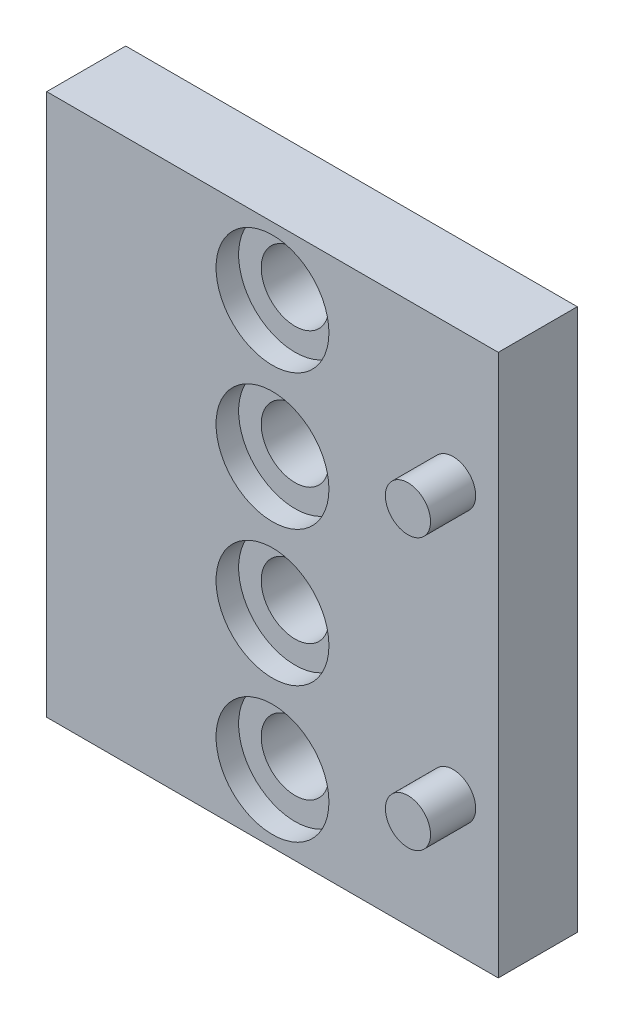
ISO-10303-21;
HEADER;
FILE_DESCRIPTION(('STEP AP214'),'2;1');
FILE_NAME('part.step','',(''),(''),'','','');
FILE_SCHEMA(('AUTOMOTIVE_DESIGN { 1 0 10303 214 1 1 1 1 }'));
ENDSEC;
DATA;
#1=APPLICATION_CONTEXT('core data for automotive mechanical design processes');
#2=APPLICATION_PROTOCOL_DEFINITION('international standard','automotive_design',2000,#1);
#3=PRODUCT_CONTEXT('',#1,'mechanical');
#4=PRODUCT('Part','Part','',(#3));
#5=PRODUCT_RELATED_PRODUCT_CATEGORY('part','',(#4));
#6=PRODUCT_DEFINITION_FORMATION('','',#4);
#7=PRODUCT_DEFINITION_CONTEXT('part definition',#1,'design');
#8=PRODUCT_DEFINITION('design','',#6,#7);
#9=PRODUCT_DEFINITION_SHAPE('','',#8);
#10=(LENGTH_UNIT() NAMED_UNIT(*) SI_UNIT(.MILLI.,.METRE.));
#11=(NAMED_UNIT(*) PLANE_ANGLE_UNIT() SI_UNIT($,.RADIAN.));
#12=(NAMED_UNIT(*) SI_UNIT($,.STERADIAN.) SOLID_ANGLE_UNIT());
#13=UNCERTAINTY_MEASURE_WITH_UNIT(LENGTH_MEASURE(1.E-05),#10,'distance_accuracy_value','');
#14=(GEOMETRIC_REPRESENTATION_CONTEXT(3) GLOBAL_UNCERTAINTY_ASSIGNED_CONTEXT((#13)) GLOBAL_UNIT_ASSIGNED_CONTEXT((#10,
#11,#12)) REPRESENTATION_CONTEXT('',''));
#15=CARTESIAN_POINT('',(0.,0.,0.));
#16=DIRECTION('',(0.,0.,1.));
#17=DIRECTION('',(1.,0.,0.));
#18=AXIS2_PLACEMENT_3D('',#15,#16,#17);
#19=CARTESIAN_POINT('',(0.,3.,0.));
#20=DIRECTION('',(0.,0.,1.));
#21=DIRECTION('',(1.,0.,0.));
#22=AXIS2_PLACEMENT_3D('',#19,#20,#21);
#23=CYLINDRICAL_SURFACE('',#22,1.5);
#24=CARTESIAN_POINT('',(0.,3.,0.4));
#25=DIRECTION('',(0.,0.,-1.));
#26=DIRECTION('',(-1.,0.,0.));
#27=AXIS2_PLACEMENT_3D('',#24,#25,#26);
#28=CIRCLE('',#27,1.5);
#29=CARTESIAN_POINT('',(-1.5,3.,0.4));
#30=VERTEX_POINT('',#29);
#31=EDGE_CURVE('E173',#30,#30,#28,.T.);
#32=ORIENTED_EDGE('',*,*,#31,.T.);
#33=EDGE_LOOP('',(#32));
#34=FACE_BOUND('',#33,.T.);
#35=CARTESIAN_POINT('',(0.,3.,2.5));
#36=DIRECTION('',(0.,0.,1.));
#37=DIRECTION('',(1.,0.,0.));
#38=AXIS2_PLACEMENT_3D('',#35,#36,#37);
#39=CIRCLE('',#38,1.5);
#40=CARTESIAN_POINT('',(1.5,3.,2.5));
#41=VERTEX_POINT('',#40);
#42=EDGE_CURVE('E39',#41,#41,#39,.F.);
#43=ORIENTED_EDGE('',*,*,#42,.F.);
#44=EDGE_LOOP('',(#43));
#45=FACE_BOUND('',#44,.T.);
#46=ADVANCED_FACE('F35',(#34,#45),#23,.F.);
#47=CARTESIAN_POINT('',(0.,-3.,0.));
#48=DIRECTION('',(0.,0.,1.));
#49=DIRECTION('',(1.,0.,0.));
#50=AXIS2_PLACEMENT_3D('',#47,#48,#49);
#51=CYLINDRICAL_SURFACE('',#50,1.5);
#52=CARTESIAN_POINT('',(0.,-3.,0.4));
#53=DIRECTION('',(0.,0.,-1.));
#54=DIRECTION('',(-1.,0.,0.));
#55=AXIS2_PLACEMENT_3D('',#52,#53,#54);
#56=CIRCLE('',#55,1.5);
#57=CARTESIAN_POINT('',(-1.5,-3.,0.4));
#58=VERTEX_POINT('',#57);
#59=EDGE_CURVE('E176',#58,#58,#56,.T.);
#60=ORIENTED_EDGE('',*,*,#59,.T.);
#61=EDGE_LOOP('',(#60));
#62=FACE_BOUND('',#61,.T.);
#63=CARTESIAN_POINT('',(0.,-3.,2.5));
#64=DIRECTION('',(0.,0.,1.));
#65=DIRECTION('',(1.,0.,0.));
#66=AXIS2_PLACEMENT_3D('',#63,#64,#65);
#67=CIRCLE('',#66,1.5);
#68=CARTESIAN_POINT('',(1.5,-3.,2.5));
#69=VERTEX_POINT('',#68);
#70=EDGE_CURVE('E190',#69,#69,#67,.F.);
#71=ORIENTED_EDGE('',*,*,#70,.F.);
#72=EDGE_LOOP('',(#71));
#73=FACE_BOUND('',#72,.T.);
#74=ADVANCED_FACE('F279',(#62,#73),#51,.F.);
#75=CARTESIAN_POINT('',(0.,-9.,0.));
#76=DIRECTION('',(0.,0.,1.));
#77=DIRECTION('',(1.,0.,0.));
#78=AXIS2_PLACEMENT_3D('',#75,#76,#77);
#79=CYLINDRICAL_SURFACE('',#78,1.5);
#80=CARTESIAN_POINT('',(0.,-9.,0.4));
#81=DIRECTION('',(0.,0.,-1.));
#82=DIRECTION('',(-1.,0.,0.));
#83=AXIS2_PLACEMENT_3D('',#80,#81,#82);
#84=CIRCLE('',#83,1.5);
#85=CARTESIAN_POINT('',(-1.5,-9.,0.4));
#86=VERTEX_POINT('',#85);
#87=EDGE_CURVE('E180',#86,#86,#84,.T.);
#88=ORIENTED_EDGE('',*,*,#87,.T.);
#89=EDGE_LOOP('',(#88));
#90=FACE_BOUND('',#89,.T.);
#91=CARTESIAN_POINT('',(0.,-9.,2.5));
#92=DIRECTION('',(0.,0.,1.));
#93=DIRECTION('',(1.,0.,0.));
#94=AXIS2_PLACEMENT_3D('',#91,#92,#93);
#95=CIRCLE('',#94,1.5);
#96=CARTESIAN_POINT('',(1.5,-9.,2.5));
#97=VERTEX_POINT('',#96);
#98=EDGE_CURVE('E188',#97,#97,#95,.F.);
#99=ORIENTED_EDGE('',*,*,#98,.F.);
#100=EDGE_LOOP('',(#99));
#101=FACE_BOUND('',#100,.T.);
#102=ADVANCED_FACE('F285',(#90,#101),#79,.F.);
#103=CARTESIAN_POINT('',(0.,9.,0.));
#104=DIRECTION('',(0.,0.,1.));
#105=DIRECTION('',(1.,0.,0.));
#106=AXIS2_PLACEMENT_3D('',#103,#104,#105);
#107=CYLINDRICAL_SURFACE('',#106,1.5);
#108=CARTESIAN_POINT('',(0.,9.,0.4));
#109=DIRECTION('',(0.,0.,-1.));
#110=DIRECTION('',(-1.,0.,0.));
#111=AXIS2_PLACEMENT_3D('',#108,#109,#110);
#112=CIRCLE('',#111,1.5);
#113=CARTESIAN_POINT('',(-1.5,9.,0.4));
#114=VERTEX_POINT('',#113);
#115=EDGE_CURVE('E144',#114,#114,#112,.T.);
#116=ORIENTED_EDGE('',*,*,#115,.T.);
#117=EDGE_LOOP('',(#116));
#118=FACE_BOUND('',#117,.T.);
#119=CARTESIAN_POINT('',(0.,9.,2.5));
#120=DIRECTION('',(0.,0.,1.));
#121=DIRECTION('',(1.,0.,0.));
#122=AXIS2_PLACEMENT_3D('',#119,#120,#121);
#123=CIRCLE('',#122,1.5);
#124=CARTESIAN_POINT('',(1.5,9.,2.5));
#125=VERTEX_POINT('',#124);
#126=EDGE_CURVE('E177',#125,#125,#123,.F.);
#127=ORIENTED_EDGE('',*,*,#126,.F.);
#128=EDGE_LOOP('',(#127));
#129=FACE_BOUND('',#128,.T.);
#130=ADVANCED_FACE('F437',(#118,#129),#107,.F.);
#131=CARTESIAN_POINT('',(-10.,12.,3.5));
#132=DIRECTION('',(1.,0.,0.));
#133=DIRECTION('',(0.,0.,-1.));
#134=AXIS2_PLACEMENT_3D('',#131,#132,#133);
#135=PLANE('',#134);
#136=DIRECTION('',(0.,-1.,0.));
#137=VECTOR('',#136,1.);
#138=CARTESIAN_POINT('',(-10.,12.,0.));
#139=LINE('',#138,#137);
#140=CARTESIAN_POINT('',(-10.,12.,0.));
#141=VERTEX_POINT('',#140);
#142=CARTESIAN_POINT('',(-10.,-12.,0.));
#143=VERTEX_POINT('',#142);
#144=EDGE_CURVE('E150',#141,#143,#139,.T.);
#145=ORIENTED_EDGE('',*,*,#144,.T.);
#146=DIRECTION('',(0.,0.,-1.));
#147=VECTOR('',#146,1.);
#148=CARTESIAN_POINT('',(-10.,-12.,3.5));
#149=LINE('',#148,#147);
#150=CARTESIAN_POINT('',(-10.,-12.,3.5));
#151=VERTEX_POINT('',#150);
#152=EDGE_CURVE('E11',#151,#143,#149,.T.);
#153=ORIENTED_EDGE('',*,*,#152,.F.);
#154=DIRECTION('',(0.,-1.,0.));
#155=VECTOR('',#154,1.);
#156=CARTESIAN_POINT('',(-10.,12.,3.5));
#157=LINE('',#156,#155);
#158=CARTESIAN_POINT('',(-10.,12.,3.5));
#159=VERTEX_POINT('',#158);
#160=EDGE_CURVE('E154',#159,#151,#157,.T.);
#161=ORIENTED_EDGE('',*,*,#160,.F.);
#162=DIRECTION('',(0.,0.,-1.));
#163=VECTOR('',#162,1.);
#164=CARTESIAN_POINT('',(-10.,12.,3.5));
#165=LINE('',#164,#163);
#166=EDGE_CURVE('E160',#159,#141,#165,.T.);
#167=ORIENTED_EDGE('',*,*,#166,.T.);
#168=EDGE_LOOP('',(#145,#153,#161,#167));
#169=FACE_BOUND('',#168,.T.);
#170=ADVANCED_FACE('F37',(#169),#135,.F.);
#171=CARTESIAN_POINT('',(-10.,-12.,3.5));
#172=DIRECTION('',(0.,1.,0.));
#173=DIRECTION('',(0.,0.,1.));
#174=AXIS2_PLACEMENT_3D('',#171,#172,#173);
#175=PLANE('',#174);
#176=DIRECTION('',(1.,0.,0.));
#177=VECTOR('',#176,1.);
#178=CARTESIAN_POINT('',(-10.,-12.,0.));
#179=LINE('',#178,#177);
#180=CARTESIAN_POINT('',(10.,-12.,0.));
#181=VERTEX_POINT('',#180);
#182=EDGE_CURVE('E163',#143,#181,#179,.T.);
#183=ORIENTED_EDGE('',*,*,#182,.T.);
#184=DIRECTION('',(0.,0.,-1.));
#185=VECTOR('',#184,1.);
#186=CARTESIAN_POINT('',(10.,-12.,3.5));
#187=LINE('',#186,#185);
#188=CARTESIAN_POINT('',(10.,-12.,3.5));
#189=VERTEX_POINT('',#188);
#190=EDGE_CURVE('E44',#189,#181,#187,.T.);
#191=ORIENTED_EDGE('',*,*,#190,.F.);
#192=DIRECTION('',(1.,0.,0.));
#193=VECTOR('',#192,1.);
#194=CARTESIAN_POINT('',(-10.,-12.,3.5));
#195=LINE('',#194,#193);
#196=EDGE_CURVE('E89',#151,#189,#195,.T.);
#197=ORIENTED_EDGE('',*,*,#196,.F.);
#198=ORIENTED_EDGE('',*,*,#152,.T.);
#199=EDGE_LOOP('',(#183,#191,#197,#198));
#200=FACE_BOUND('',#199,.T.);
#201=ADVANCED_FACE('F262',(#200),#175,.F.);
#202=CARTESIAN_POINT('',(10.,12.,3.5));
#203=DIRECTION('',(-1.,0.,0.));
#204=DIRECTION('',(0.,-1.,0.));
#205=AXIS2_PLACEMENT_3D('',#202,#203,#204);
#206=PLANE('',#205);
#207=DIRECTION('',(0.,1.,0.));
#208=VECTOR('',#207,1.);
#209=CARTESIAN_POINT('',(10.,12.,0.));
#210=LINE('',#209,#208);
#211=CARTESIAN_POINT('',(10.,12.,0.));
#212=VERTEX_POINT('',#211);
#213=EDGE_CURVE('E165',#181,#212,#210,.T.);
#214=ORIENTED_EDGE('',*,*,#213,.T.);
#215=DIRECTION('',(0.,0.,-1.));
#216=VECTOR('',#215,1.);
#217=CARTESIAN_POINT('',(10.,12.,3.5));
#218=LINE('',#217,#216);
#219=CARTESIAN_POINT('',(10.,12.,3.5));
#220=VERTEX_POINT('',#219);
#221=EDGE_CURVE('E169',#220,#212,#218,.T.);
#222=ORIENTED_EDGE('',*,*,#221,.F.);
#223=DIRECTION('',(0.,1.,0.));
#224=VECTOR('',#223,1.);
#225=CARTESIAN_POINT('',(10.,12.,3.5));
#226=LINE('',#225,#224);
#227=EDGE_CURVE('E157',#189,#220,#226,.T.);
#228=ORIENTED_EDGE('',*,*,#227,.F.);
#229=ORIENTED_EDGE('',*,*,#190,.T.);
#230=EDGE_LOOP('',(#214,#222,#228,#229));
#231=FACE_BOUND('',#230,.T.);
#232=ADVANCED_FACE('F267',(#231),#206,.F.);
#233=CARTESIAN_POINT('',(-10.,12.,3.5));
#234=DIRECTION('',(0.,-1.,0.));
#235=DIRECTION('',(0.,0.,-1.));
#236=AXIS2_PLACEMENT_3D('',#233,#234,#235);
#237=PLANE('',#236);
#238=DIRECTION('',(-1.,0.,0.));
#239=VECTOR('',#238,1.);
#240=CARTESIAN_POINT('',(-10.,12.,0.));
#241=LINE('',#240,#239);
#242=EDGE_CURVE('E82',#212,#141,#241,.T.);
#243=ORIENTED_EDGE('',*,*,#242,.T.);
#244=ORIENTED_EDGE('',*,*,#166,.F.);
#245=DIRECTION('',(-1.,0.,0.));
#246=VECTOR('',#245,1.);
#247=CARTESIAN_POINT('',(-10.,12.,3.5));
#248=LINE('',#247,#246);
#249=EDGE_CURVE('E61',#220,#159,#248,.T.);
#250=ORIENTED_EDGE('',*,*,#249,.F.);
#251=ORIENTED_EDGE('',*,*,#221,.T.);
#252=EDGE_LOOP('',(#243,#244,#250,#251));
#253=FACE_BOUND('',#252,.T.);
#254=ADVANCED_FACE('F248',(#253),#237,.F.);
#255=CARTESIAN_POINT('',(0.,0.,3.5));
#256=DIRECTION('',(0.,0.,1.));
#257=DIRECTION('',(1.,0.,0.));
#258=AXIS2_PLACEMENT_3D('',#255,#256,#257);
#259=PLANE('',#258);
#260=CARTESIAN_POINT('',(8.,-6.,3.5));
#261=DIRECTION('',(0.,0.,1.));
#262=DIRECTION('',(-1.,0.,0.));
#263=AXIS2_PLACEMENT_3D('',#260,#261,#262);
#264=CIRCLE('',#263,1.);
#265=CARTESIAN_POINT('',(7.,-6.,3.5));
#266=VERTEX_POINT('',#265);
#267=EDGE_CURVE('E229',#266,#266,#264,.T.);
#268=ORIENTED_EDGE('',*,*,#267,.F.);
#269=EDGE_LOOP('',(#268));
#270=FACE_BOUND('',#269,.T.);
#271=CARTESIAN_POINT('',(8.,6.,3.5));
#272=DIRECTION('',(0.,0.,1.));
#273=DIRECTION('',(1.,0.,0.));
#274=AXIS2_PLACEMENT_3D('',#271,#272,#273);
#275=CIRCLE('',#274,1.);
#276=CARTESIAN_POINT('',(9.,6.,3.5));
#277=VERTEX_POINT('',#276);
#278=EDGE_CURVE('E223',#277,#277,#275,.T.);
#279=ORIENTED_EDGE('',*,*,#278,.F.);
#280=EDGE_LOOP('',(#279));
#281=FACE_BOUND('',#280,.T.);
#282=CARTESIAN_POINT('',(0.,3.,3.5));
#283=DIRECTION('',(0.,0.,1.));
#284=DIRECTION('',(1.,0.,0.));
#285=AXIS2_PLACEMENT_3D('',#282,#283,#284);
#286=CIRCLE('',#285,2.5);
#287=CARTESIAN_POINT('',(2.5,3.,3.5));
#288=VERTEX_POINT('',#287);
#289=EDGE_CURVE('E218',#288,#288,#286,.T.);
#290=ORIENTED_EDGE('',*,*,#289,.F.);
#291=EDGE_LOOP('',(#290));
#292=FACE_BOUND('',#291,.T.);
#293=CARTESIAN_POINT('',(0.,-3.,3.5));
#294=DIRECTION('',(0.,0.,1.));
#295=DIRECTION('',(1.,0.,0.));
#296=AXIS2_PLACEMENT_3D('',#293,#294,#295);
#297=CIRCLE('',#296,2.5);
#298=CARTESIAN_POINT('',(2.5,-3.,3.5));
#299=VERTEX_POINT('',#298);
#300=EDGE_CURVE('E212',#299,#299,#297,.T.);
#301=ORIENTED_EDGE('',*,*,#300,.F.);
#302=EDGE_LOOP('',(#301));
#303=FACE_BOUND('',#302,.T.);
#304=CARTESIAN_POINT('',(0.,-9.,3.5));
#305=DIRECTION('',(0.,0.,1.));
#306=DIRECTION('',(1.,0.,0.));
#307=AXIS2_PLACEMENT_3D('',#304,#305,#306);
#308=CIRCLE('',#307,2.5);
#309=CARTESIAN_POINT('',(2.5,-9.,3.5));
#310=VERTEX_POINT('',#309);
#311=EDGE_CURVE('E205',#310,#310,#308,.T.);
#312=ORIENTED_EDGE('',*,*,#311,.F.);
#313=EDGE_LOOP('',(#312));
#314=FACE_BOUND('',#313,.T.);
#315=CARTESIAN_POINT('',(0.,9.,3.5));
#316=DIRECTION('',(0.,0.,1.));
#317=DIRECTION('',(1.,0.,0.));
#318=AXIS2_PLACEMENT_3D('',#315,#316,#317);
#319=CIRCLE('',#318,2.5);
#320=CARTESIAN_POINT('',(2.5,9.,3.5));
#321=VERTEX_POINT('',#320);
#322=EDGE_CURVE('E137',#321,#321,#319,.T.);
#323=ORIENTED_EDGE('',*,*,#322,.F.);
#324=EDGE_LOOP('',(#323));
#325=FACE_BOUND('',#324,.T.);
#326=ORIENTED_EDGE('',*,*,#160,.T.);
#327=ORIENTED_EDGE('',*,*,#196,.T.);
#328=ORIENTED_EDGE('',*,*,#227,.T.);
#329=ORIENTED_EDGE('',*,*,#249,.T.);
#330=EDGE_LOOP('',(#326,#327,#328,#329));
#331=FACE_BOUND('',#330,.T.);
#332=ADVANCED_FACE('F244',(#270,#281,#292,#303,#314,#325,#331),#259,.T.);
#333=CARTESIAN_POINT('',(0.,0.,0.));
#334=DIRECTION('',(0.,0.,1.));
#335=DIRECTION('',(1.,0.,0.));
#336=AXIS2_PLACEMENT_3D('',#333,#334,#335);
#337=PLANE('',#336);
#338=DIRECTION('',(-1.,0.,0.));
#339=VECTOR('',#338,1.);
#340=CARTESIAN_POINT('',(8.,-11.,0.));
#341=LINE('',#340,#339);
#342=CARTESIAN_POINT('',(8.,-11.,0.));
#343=VERTEX_POINT('',#342);
#344=CARTESIAN_POINT('',(-8.,-11.,0.));
#345=VERTEX_POINT('',#344);
#346=EDGE_CURVE('E143',#343,#345,#341,.T.);
#347=ORIENTED_EDGE('',*,*,#346,.F.);
#348=DIRECTION('',(0.,-1.,0.));
#349=VECTOR('',#348,1.);
#350=CARTESIAN_POINT('',(8.,11.,0.));
#351=LINE('',#350,#349);
#352=CARTESIAN_POINT('',(8.,11.,0.));
#353=VERTEX_POINT('',#352);
#354=EDGE_CURVE('E52',#353,#343,#351,.T.);
#355=ORIENTED_EDGE('',*,*,#354,.F.);
#356=DIRECTION('',(1.,0.,0.));
#357=VECTOR('',#356,1.);
#358=CARTESIAN_POINT('',(8.,11.,0.));
#359=LINE('',#358,#357);
#360=CARTESIAN_POINT('',(-8.,11.,0.));
#361=VERTEX_POINT('',#360);
#362=EDGE_CURVE('E131',#361,#353,#359,.T.);
#363=ORIENTED_EDGE('',*,*,#362,.F.);
#364=DIRECTION('',(0.,1.,0.));
#365=VECTOR('',#364,1.);
#366=CARTESIAN_POINT('',(-8.,11.,0.));
#367=LINE('',#366,#365);
#368=EDGE_CURVE('E134',#345,#361,#367,.T.);
#369=ORIENTED_EDGE('',*,*,#368,.F.);
#370=EDGE_LOOP('',(#347,#355,#363,#369));
#371=FACE_BOUND('',#370,.T.);
#372=ORIENTED_EDGE('',*,*,#144,.F.);
#373=ORIENTED_EDGE('',*,*,#242,.F.);
#374=ORIENTED_EDGE('',*,*,#213,.F.);
#375=ORIENTED_EDGE('',*,*,#182,.F.);
#376=EDGE_LOOP('',(#372,#373,#374,#375));
#377=FACE_BOUND('',#376,.T.);
#378=ADVANCED_FACE('F247',(#371,#377),#337,.F.);
#379=CARTESIAN_POINT('',(8.,11.,0.4));
#380=DIRECTION('',(1.,0.,0.));
#381=DIRECTION('',(0.,0.,-1.));
#382=AXIS2_PLACEMENT_3D('',#379,#380,#381);
#383=PLANE('',#382);
#384=ORIENTED_EDGE('',*,*,#354,.T.);
#385=DIRECTION('',(0.,0.,-1.));
#386=VECTOR('',#385,1.);
#387=CARTESIAN_POINT('',(8.,-11.,0.4));
#388=LINE('',#387,#386);
#389=CARTESIAN_POINT('',(8.,-11.,0.4));
#390=VERTEX_POINT('',#389);
#391=EDGE_CURVE('E109',#390,#343,#388,.T.);
#392=ORIENTED_EDGE('',*,*,#391,.F.);
#393=DIRECTION('',(0.,-1.,0.));
#394=VECTOR('',#393,1.);
#395=CARTESIAN_POINT('',(8.,11.,0.4));
#396=LINE('',#395,#394);
#397=CARTESIAN_POINT('',(8.,11.,0.4));
#398=VERTEX_POINT('',#397);
#399=EDGE_CURVE('E113',#398,#390,#396,.T.);
#400=ORIENTED_EDGE('',*,*,#399,.F.);
#401=DIRECTION('',(0.,0.,-1.));
#402=VECTOR('',#401,1.);
#403=CARTESIAN_POINT('',(8.,11.,0.4));
#404=LINE('',#403,#402);
#405=EDGE_CURVE('E148',#398,#353,#404,.T.);
#406=ORIENTED_EDGE('',*,*,#405,.T.);
#407=EDGE_LOOP('',(#384,#392,#400,#406));
#408=FACE_BOUND('',#407,.T.);
#409=ADVANCED_FACE('F111',(#408),#383,.F.);
#410=CARTESIAN_POINT('',(8.,11.,0.4));
#411=DIRECTION('',(0.,1.,0.));
#412=DIRECTION('',(0.,0.,1.));
#413=AXIS2_PLACEMENT_3D('',#410,#411,#412);
#414=PLANE('',#413);
#415=ORIENTED_EDGE('',*,*,#362,.T.);
#416=ORIENTED_EDGE('',*,*,#405,.F.);
#417=DIRECTION('',(1.,0.,0.));
#418=VECTOR('',#417,1.);
#419=CARTESIAN_POINT('',(8.,11.,0.4));
#420=LINE('',#419,#418);
#421=CARTESIAN_POINT('',(-8.,11.,0.4));
#422=VERTEX_POINT('',#421);
#423=EDGE_CURVE('E119',#422,#398,#420,.T.);
#424=ORIENTED_EDGE('',*,*,#423,.F.);
#425=DIRECTION('',(0.,0.,-1.));
#426=VECTOR('',#425,1.);
#427=CARTESIAN_POINT('',(-8.,11.,0.4));
#428=LINE('',#427,#426);
#429=EDGE_CURVE('E151',#422,#361,#428,.T.);
#430=ORIENTED_EDGE('',*,*,#429,.T.);
#431=EDGE_LOOP('',(#415,#416,#424,#430));
#432=FACE_BOUND('',#431,.T.);
#433=ADVANCED_FACE('F275',(#432),#414,.F.);
#434=CARTESIAN_POINT('',(-8.,11.,0.4));
#435=DIRECTION('',(-1.,0.,0.));
#436=DIRECTION('',(0.,-1.,0.));
#437=AXIS2_PLACEMENT_3D('',#434,#435,#436);
#438=PLANE('',#437);
#439=ORIENTED_EDGE('',*,*,#368,.T.);
#440=ORIENTED_EDGE('',*,*,#429,.F.);
#441=DIRECTION('',(0.,1.,0.));
#442=VECTOR('',#441,1.);
#443=CARTESIAN_POINT('',(-8.,11.,0.4));
#444=LINE('',#443,#442);
#445=CARTESIAN_POINT('',(-8.,-11.,0.4));
#446=VERTEX_POINT('',#445);
#447=EDGE_CURVE('E127',#446,#422,#444,.T.);
#448=ORIENTED_EDGE('',*,*,#447,.F.);
#449=DIRECTION('',(0.,0.,-1.));
#450=VECTOR('',#449,1.);
#451=CARTESIAN_POINT('',(-8.,-11.,0.4));
#452=LINE('',#451,#450);
#453=EDGE_CURVE('E118',#446,#345,#452,.T.);
#454=ORIENTED_EDGE('',*,*,#453,.T.);
#455=EDGE_LOOP('',(#439,#440,#448,#454));
#456=FACE_BOUND('',#455,.T.);
#457=ADVANCED_FACE('F298',(#456),#438,.F.);
#458=CARTESIAN_POINT('',(8.,-11.,0.4));
#459=DIRECTION('',(0.,-1.,0.));
#460=DIRECTION('',(0.,0.,-1.));
#461=AXIS2_PLACEMENT_3D('',#458,#459,#460);
#462=PLANE('',#461);
#463=ORIENTED_EDGE('',*,*,#346,.T.);
#464=ORIENTED_EDGE('',*,*,#453,.F.);
#465=DIRECTION('',(-1.,0.,0.));
#466=VECTOR('',#465,1.);
#467=CARTESIAN_POINT('',(8.,-11.,0.4));
#468=LINE('',#467,#466);
#469=EDGE_CURVE('E122',#390,#446,#468,.T.);
#470=ORIENTED_EDGE('',*,*,#469,.F.);
#471=ORIENTED_EDGE('',*,*,#391,.T.);
#472=EDGE_LOOP('',(#463,#464,#470,#471));
#473=FACE_BOUND('',#472,.T.);
#474=ADVANCED_FACE('F123',(#473),#462,.F.);
#475=CARTESIAN_POINT('',(0.,0.,0.4));
#476=DIRECTION('',(0.,0.,-1.));
#477=DIRECTION('',(-1.,0.,0.));
#478=AXIS2_PLACEMENT_3D('',#475,#476,#477);
#479=PLANE('',#478);
#480=ORIENTED_EDGE('',*,*,#115,.F.);
#481=EDGE_LOOP('',(#480));
#482=FACE_BOUND('',#481,.T.);
#483=ORIENTED_EDGE('',*,*,#87,.F.);
#484=EDGE_LOOP('',(#483));
#485=FACE_BOUND('',#484,.T.);
#486=ORIENTED_EDGE('',*,*,#59,.F.);
#487=EDGE_LOOP('',(#486));
#488=FACE_BOUND('',#487,.T.);
#489=ORIENTED_EDGE('',*,*,#31,.F.);
#490=EDGE_LOOP('',(#489));
#491=FACE_BOUND('',#490,.T.);
#492=ORIENTED_EDGE('',*,*,#399,.T.);
#493=ORIENTED_EDGE('',*,*,#469,.T.);
#494=ORIENTED_EDGE('',*,*,#447,.T.);
#495=ORIENTED_EDGE('',*,*,#423,.T.);
#496=EDGE_LOOP('',(#492,#493,#494,#495));
#497=FACE_BOUND('',#496,.T.);
#498=ADVANCED_FACE('F129',(#482,#485,#488,#491,#497),#479,.T.);
#499=CARTESIAN_POINT('',(0.,9.,2.5));
#500=DIRECTION('',(0.,0.,1.));
#501=DIRECTION('',(1.,0.,0.));
#502=AXIS2_PLACEMENT_3D('',#499,#500,#501);
#503=PLANE('',#502);
#504=CARTESIAN_POINT('',(0.,9.,2.5));
#505=DIRECTION('',(0.,0.,1.));
#506=DIRECTION('',(1.,0.,0.));
#507=AXIS2_PLACEMENT_3D('',#504,#505,#506);
#508=CIRCLE('',#507,2.5);
#509=CARTESIAN_POINT('',(2.5,9.,2.5));
#510=VERTEX_POINT('',#509);
#511=EDGE_CURVE('E187',#510,#510,#508,.T.);
#512=ORIENTED_EDGE('',*,*,#511,.T.);
#513=EDGE_LOOP('',(#512));
#514=FACE_BOUND('',#513,.T.);
#515=ORIENTED_EDGE('',*,*,#126,.T.);
#516=EDGE_LOOP('',(#515));
#517=FACE_BOUND('',#516,.T.);
#518=ADVANCED_FACE('F294',(#514,#517),#503,.T.);
#519=CARTESIAN_POINT('',(0.,9.,2.5));
#520=DIRECTION('',(0.,0.,1.));
#521=DIRECTION('',(1.,0.,0.));
#522=AXIS2_PLACEMENT_3D('',#519,#520,#521);
#523=CYLINDRICAL_SURFACE('',#522,2.5);
#524=ORIENTED_EDGE('',*,*,#511,.F.);
#525=EDGE_LOOP('',(#524));
#526=FACE_BOUND('',#525,.T.);
#527=ORIENTED_EDGE('',*,*,#322,.T.);
#528=EDGE_LOOP('',(#527));
#529=FACE_BOUND('',#528,.T.);
#530=ADVANCED_FACE('F319',(#526,#529),#523,.F.);
#531=CARTESIAN_POINT('',(0.,-9.,2.5));
#532=DIRECTION('',(0.,0.,1.));
#533=DIRECTION('',(1.,0.,0.));
#534=AXIS2_PLACEMENT_3D('',#531,#532,#533);
#535=PLANE('',#534);
#536=CARTESIAN_POINT('',(0.,-9.,2.5));
#537=DIRECTION('',(0.,0.,1.));
#538=DIRECTION('',(1.,0.,0.));
#539=AXIS2_PLACEMENT_3D('',#536,#537,#538);
#540=CIRCLE('',#539,2.5);
#541=CARTESIAN_POINT('',(2.5,-9.,2.5));
#542=VERTEX_POINT('',#541);
#543=EDGE_CURVE('E208',#542,#542,#540,.T.);
#544=ORIENTED_EDGE('',*,*,#543,.T.);
#545=EDGE_LOOP('',(#544));
#546=FACE_BOUND('',#545,.T.);
#547=ORIENTED_EDGE('',*,*,#98,.T.);
#548=EDGE_LOOP('',(#547));
#549=FACE_BOUND('',#548,.T.);
#550=ADVANCED_FACE('F326',(#546,#549),#535,.T.);
#551=CARTESIAN_POINT('',(0.,-9.,2.5));
#552=DIRECTION('',(0.,0.,1.));
#553=DIRECTION('',(1.,0.,0.));
#554=AXIS2_PLACEMENT_3D('',#551,#552,#553);
#555=CYLINDRICAL_SURFACE('',#554,2.5);
#556=ORIENTED_EDGE('',*,*,#543,.F.);
#557=EDGE_LOOP('',(#556));
#558=FACE_BOUND('',#557,.T.);
#559=ORIENTED_EDGE('',*,*,#311,.T.);
#560=EDGE_LOOP('',(#559));
#561=FACE_BOUND('',#560,.T.);
#562=ADVANCED_FACE('F334',(#558,#561),#555,.F.);
#563=CARTESIAN_POINT('',(0.,-3.,2.5));
#564=DIRECTION('',(0.,0.,1.));
#565=DIRECTION('',(1.,0.,0.));
#566=AXIS2_PLACEMENT_3D('',#563,#564,#565);
#567=PLANE('',#566);
#568=CARTESIAN_POINT('',(0.,-3.,2.5));
#569=DIRECTION('',(0.,0.,1.));
#570=DIRECTION('',(1.,0.,0.));
#571=AXIS2_PLACEMENT_3D('',#568,#569,#570);
#572=CIRCLE('',#571,2.5);
#573=CARTESIAN_POINT('',(2.5,-3.,2.5));
#574=VERTEX_POINT('',#573);
#575=EDGE_CURVE('E215',#574,#574,#572,.T.);
#576=ORIENTED_EDGE('',*,*,#575,.T.);
#577=EDGE_LOOP('',(#576));
#578=FACE_BOUND('',#577,.T.);
#579=ORIENTED_EDGE('',*,*,#70,.T.);
#580=EDGE_LOOP('',(#579));
#581=FACE_BOUND('',#580,.T.);
#582=ADVANCED_FACE('F343',(#578,#581),#567,.T.);
#583=CARTESIAN_POINT('',(0.,-3.,2.5));
#584=DIRECTION('',(0.,0.,1.));
#585=DIRECTION('',(1.,0.,0.));
#586=AXIS2_PLACEMENT_3D('',#583,#584,#585);
#587=CYLINDRICAL_SURFACE('',#586,2.5);
#588=ORIENTED_EDGE('',*,*,#575,.F.);
#589=EDGE_LOOP('',(#588));
#590=FACE_BOUND('',#589,.T.);
#591=ORIENTED_EDGE('',*,*,#300,.T.);
#592=EDGE_LOOP('',(#591));
#593=FACE_BOUND('',#592,.T.);
#594=ADVANCED_FACE('F351',(#590,#593),#587,.F.);
#595=CARTESIAN_POINT('',(0.,3.,2.5));
#596=DIRECTION('',(0.,0.,1.));
#597=DIRECTION('',(1.,0.,0.));
#598=AXIS2_PLACEMENT_3D('',#595,#596,#597);
#599=PLANE('',#598);
#600=CARTESIAN_POINT('',(0.,3.,2.5));
#601=DIRECTION('',(0.,0.,1.));
#602=DIRECTION('',(1.,0.,0.));
#603=AXIS2_PLACEMENT_3D('',#600,#601,#602);
#604=CIRCLE('',#603,2.5);
#605=CARTESIAN_POINT('',(2.5,3.,2.5));
#606=VERTEX_POINT('',#605);
#607=EDGE_CURVE('E191',#606,#606,#604,.T.);
#608=ORIENTED_EDGE('',*,*,#607,.T.);
#609=EDGE_LOOP('',(#608));
#610=FACE_BOUND('',#609,.T.);
#611=ORIENTED_EDGE('',*,*,#42,.T.);
#612=EDGE_LOOP('',(#611));
#613=FACE_BOUND('',#612,.T.);
#614=ADVANCED_FACE('F359',(#610,#613),#599,.T.);
#615=CARTESIAN_POINT('',(0.,3.,2.5));
#616=DIRECTION('',(0.,0.,1.));
#617=DIRECTION('',(1.,0.,0.));
#618=AXIS2_PLACEMENT_3D('',#615,#616,#617);
#619=CYLINDRICAL_SURFACE('',#618,2.5);
#620=ORIENTED_EDGE('',*,*,#607,.F.);
#621=EDGE_LOOP('',(#620));
#622=FACE_BOUND('',#621,.T.);
#623=ORIENTED_EDGE('',*,*,#289,.T.);
#624=EDGE_LOOP('',(#623));
#625=FACE_BOUND('',#624,.T.);
#626=ADVANCED_FACE('F367',(#622,#625),#619,.F.);
#627=CARTESIAN_POINT('',(8.,6.,5.5));
#628=DIRECTION('',(0.,0.,-1.));
#629=DIRECTION('',(-1.,0.,0.));
#630=AXIS2_PLACEMENT_3D('',#627,#628,#629);
#631=CYLINDRICAL_SURFACE('',#630,1.);
#632=CARTESIAN_POINT('',(8.,6.,5.5));
#633=DIRECTION('',(0.,0.,1.));
#634=DIRECTION('',(1.,0.,0.));
#635=AXIS2_PLACEMENT_3D('',#632,#633,#634);
#636=CIRCLE('',#635,1.);
#637=CARTESIAN_POINT('',(9.,6.,5.5));
#638=VERTEX_POINT('',#637);
#639=EDGE_CURVE('E209',#638,#638,#636,.T.);
#640=ORIENTED_EDGE('',*,*,#639,.F.);
#641=EDGE_LOOP('',(#640));
#642=FACE_BOUND('',#641,.T.);
#643=ORIENTED_EDGE('',*,*,#278,.T.);
#644=EDGE_LOOP('',(#643));
#645=FACE_BOUND('',#644,.T.);
#646=ADVANCED_FACE('F375',(#642,#645),#631,.T.);
#647=CARTESIAN_POINT('',(8.,6.,5.5));
#648=DIRECTION('',(0.,0.,1.));
#649=DIRECTION('',(1.,0.,0.));
#650=AXIS2_PLACEMENT_3D('',#647,#648,#649);
#651=PLANE('',#650);
#652=ORIENTED_EDGE('',*,*,#639,.T.);
#653=EDGE_LOOP('',(#652));
#654=FACE_BOUND('',#653,.T.);
#655=ADVANCED_FACE('F240',(#654),#651,.T.);
#656=CARTESIAN_POINT('',(8.,-6.,5.5));
#657=DIRECTION('',(0.,0.,-1.));
#658=DIRECTION('',(-1.,0.,0.));
#659=AXIS2_PLACEMENT_3D('',#656,#657,#658);
#660=CYLINDRICAL_SURFACE('',#659,1.);
#661=CARTESIAN_POINT('',(8.,-6.,5.5));
#662=DIRECTION('',(0.,0.,1.));
#663=DIRECTION('',(-1.,0.,0.));
#664=AXIS2_PLACEMENT_3D('',#661,#662,#663);
#665=CIRCLE('',#664,1.);
#666=CARTESIAN_POINT('',(7.,-6.,5.5));
#667=VERTEX_POINT('',#666);
#668=EDGE_CURVE('E226',#667,#667,#665,.T.);
#669=ORIENTED_EDGE('',*,*,#668,.F.);
#670=EDGE_LOOP('',(#669));
#671=FACE_BOUND('',#670,.T.);
#672=ORIENTED_EDGE('',*,*,#267,.T.);
#673=EDGE_LOOP('',(#672));
#674=FACE_BOUND('',#673,.T.);
#675=ADVANCED_FACE('F237',(#671,#674),#660,.T.);
#676=CARTESIAN_POINT('',(8.,-6.,5.5));
#677=DIRECTION('',(0.,0.,-1.));
#678=DIRECTION('',(-1.,0.,0.));
#679=AXIS2_PLACEMENT_3D('',#676,#677,#678);
#680=PLANE('',#679);
#681=ORIENTED_EDGE('',*,*,#668,.T.);
#682=EDGE_LOOP('',(#681));
#683=FACE_BOUND('',#682,.T.);
#684=ADVANCED_FACE('F235',(#683),#680,.F.);
#685=CLOSED_SHELL('',(#46,#74,#102,#130,#170,#201,#232,#254,#332,#378,#409,#433,#457,#474,#498,
#518,#530,#550,#562,#582,#594,#614,#626,#646,#655,#675,#684));
#686=MANIFOLD_SOLID_BREP('B2',#685);
#687=ADVANCED_BREP_SHAPE_REPRESENTATION('',(#18,#686),#14);
#688=SHAPE_DEFINITION_REPRESENTATION(#9,#687);
ENDSEC;
END-ISO-10303-21;
